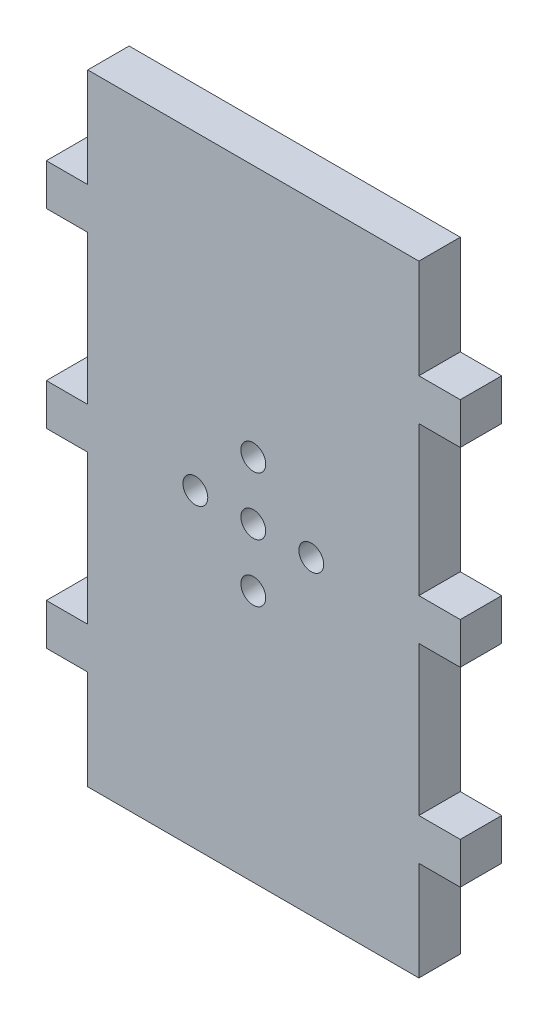
ISO-10303-21;
HEADER;
FILE_DESCRIPTION(('STEP AP214'),'2;1');
FILE_NAME('part.step','',(''),(''),'','','');
FILE_SCHEMA(('AUTOMOTIVE_DESIGN { 1 0 10303 214 1 1 1 1 }'));
ENDSEC;
DATA;
#1=APPLICATION_CONTEXT('core data for automotive mechanical design processes');
#2=APPLICATION_PROTOCOL_DEFINITION('international standard','automotive_design',2000,#1);
#3=PRODUCT_CONTEXT('',#1,'mechanical');
#4=PRODUCT('Part','Part','',(#3));
#5=PRODUCT_RELATED_PRODUCT_CATEGORY('part','',(#4));
#6=PRODUCT_DEFINITION_FORMATION('','',#4);
#7=PRODUCT_DEFINITION_CONTEXT('part definition',#1,'design');
#8=PRODUCT_DEFINITION('design','',#6,#7);
#9=PRODUCT_DEFINITION_SHAPE('','',#8);
#10=(LENGTH_UNIT() NAMED_UNIT(*) SI_UNIT(.MILLI.,.METRE.));
#11=(NAMED_UNIT(*) PLANE_ANGLE_UNIT() SI_UNIT($,.RADIAN.));
#12=(NAMED_UNIT(*) SI_UNIT($,.STERADIAN.) SOLID_ANGLE_UNIT());
#13=UNCERTAINTY_MEASURE_WITH_UNIT(LENGTH_MEASURE(1.E-05),#10,'distance_accuracy_value','');
#14=(GEOMETRIC_REPRESENTATION_CONTEXT(3) GLOBAL_UNCERTAINTY_ASSIGNED_CONTEXT((#13)) GLOBAL_UNIT_ASSIGNED_CONTEXT((#10,
#11,#12)) REPRESENTATION_CONTEXT('',''));
#15=CARTESIAN_POINT('',(0.,0.,0.));
#16=DIRECTION('',(0.,0.,1.));
#17=DIRECTION('',(1.,0.,0.));
#18=AXIS2_PLACEMENT_3D('',#15,#16,#17);
#19=CARTESIAN_POINT('',(0.,0.,5.));
#20=DIRECTION('',(0.,0.,-1.));
#21=DIRECTION('',(-1.,0.,0.));
#22=AXIS2_PLACEMENT_3D('',#19,#20,#21);
#23=PLANE('',#22);
#24=DIRECTION('',(-1.,0.,0.));
#25=VECTOR('',#24,1.);
#26=CARTESIAN_POINT('',(0.,9.97034237203474,5.));
#27=LINE('',#26,#25);
#28=CARTESIAN_POINT('',(40.,9.97034237203474,5.));
#29=VERTEX_POINT('',#28);
#30=CARTESIAN_POINT('',(0.,9.97034237203474,5.));
#31=VERTEX_POINT('',#30);
#32=EDGE_CURVE('E313',#29,#31,#27,.T.);
#33=ORIENTED_EDGE('',*,*,#32,.T.);
#34=DIRECTION('',(0.,-1.,0.));
#35=VECTOR('',#34,1.);
#36=CARTESIAN_POINT('',(0.,9.97034237203474,5.));
#37=LINE('',#36,#35);
#38=CARTESIAN_POINT('',(0.,-2.02965762796526,5.));
#39=VERTEX_POINT('',#38);
#40=EDGE_CURVE('E163',#31,#39,#37,.T.);
#41=ORIENTED_EDGE('',*,*,#40,.T.);
#42=DIRECTION('',(-1.,0.,0.));
#43=VECTOR('',#42,1.);
#44=CARTESIAN_POINT('',(0.,-2.02965762796526,5.));
#45=LINE('',#44,#43);
#46=CARTESIAN_POINT('',(-5.00000000000001,-2.02965762796526,5.));
#47=VERTEX_POINT('',#46);
#48=EDGE_CURVE('E387',#39,#47,#45,.T.);
#49=ORIENTED_EDGE('',*,*,#48,.T.);
#50=DIRECTION('',(0.,-1.,0.));
#51=VECTOR('',#50,1.);
#52=CARTESIAN_POINT('',(-5.00000000000001,-2.02965762796526,5.));
#53=LINE('',#52,#51);
#54=CARTESIAN_POINT('',(-5.00000000000001,-7.02965762796526,5.));
#55=VERTEX_POINT('',#54);
#56=EDGE_CURVE('E410',#47,#55,#53,.T.);
#57=ORIENTED_EDGE('',*,*,#56,.T.);
#58=DIRECTION('',(1.,0.,0.));
#59=VECTOR('',#58,1.);
#60=CARTESIAN_POINT('',(-5.00000000000001,-7.02965762796526,5.));
#61=LINE('',#60,#59);
#62=CARTESIAN_POINT('',(0.,-7.02965762796526,5.));
#63=VERTEX_POINT('',#62);
#64=EDGE_CURVE('E402',#55,#63,#61,.T.);
#65=ORIENTED_EDGE('',*,*,#64,.T.);
#66=DIRECTION('',(0.,-1.,0.));
#67=VECTOR('',#66,1.);
#68=CARTESIAN_POINT('',(0.,-7.02965762796526,5.));
#69=LINE('',#68,#67);
#70=CARTESIAN_POINT('',(0.,-25.0296576279653,5.));
#71=VERTEX_POINT('',#70);
#72=EDGE_CURVE('E406',#63,#71,#69,.T.);
#73=ORIENTED_EDGE('',*,*,#72,.T.);
#74=DIRECTION('',(-1.,0.,0.));
#75=VECTOR('',#74,1.);
#76=CARTESIAN_POINT('',(0.,-25.0296576279653,5.));
#77=LINE('',#76,#75);
#78=CARTESIAN_POINT('',(-5.,-25.0296576279653,5.));
#79=VERTEX_POINT('',#78);
#80=EDGE_CURVE('E407',#71,#79,#77,.T.);
#81=ORIENTED_EDGE('',*,*,#80,.T.);
#82=DIRECTION('',(0.,-1.,0.));
#83=VECTOR('',#82,1.);
#84=CARTESIAN_POINT('',(-5.,-25.0296576279653,5.));
#85=LINE('',#84,#83);
#86=CARTESIAN_POINT('',(-5.,-30.0296576279653,5.));
#87=VERTEX_POINT('',#86);
#88=EDGE_CURVE('E414',#79,#87,#85,.T.);
#89=ORIENTED_EDGE('',*,*,#88,.T.);
#90=DIRECTION('',(1.,0.,0.));
#91=VECTOR('',#90,1.);
#92=CARTESIAN_POINT('',(-5.,-30.0296576279653,5.));
#93=LINE('',#92,#91);
#94=CARTESIAN_POINT('',(0.,-30.0296576279653,5.));
#95=VERTEX_POINT('',#94);
#96=EDGE_CURVE('E420',#87,#95,#93,.T.);
#97=ORIENTED_EDGE('',*,*,#96,.T.);
#98=DIRECTION('',(0.,-1.,0.));
#99=VECTOR('',#98,1.);
#100=CARTESIAN_POINT('',(0.,-30.0296576279653,5.));
#101=LINE('',#100,#99);
#102=CARTESIAN_POINT('',(0.,-48.0296576279653,5.));
#103=VERTEX_POINT('',#102);
#104=EDGE_CURVE('E416',#95,#103,#101,.T.);
#105=ORIENTED_EDGE('',*,*,#104,.T.);
#106=DIRECTION('',(-1.,0.,0.));
#107=VECTOR('',#106,1.);
#108=CARTESIAN_POINT('',(-4.99999999999999,-48.0296576279653,5.));
#109=LINE('',#108,#107);
#110=CARTESIAN_POINT('',(-4.99999999999999,-48.0296576279653,5.));
#111=VERTEX_POINT('',#110);
#112=EDGE_CURVE('E423',#103,#111,#109,.T.);
#113=ORIENTED_EDGE('',*,*,#112,.T.);
#114=DIRECTION('',(0.,-1.,0.));
#115=VECTOR('',#114,1.);
#116=CARTESIAN_POINT('',(-4.99999999999999,-53.0296576279653,5.));
#117=LINE('',#116,#115);
#118=CARTESIAN_POINT('',(-4.99999999999999,-53.0296576279653,5.));
#119=VERTEX_POINT('',#118);
#120=EDGE_CURVE('E422',#111,#119,#117,.T.);
#121=ORIENTED_EDGE('',*,*,#120,.T.);
#122=DIRECTION('',(1.,0.,0.));
#123=VECTOR('',#122,1.);
#124=CARTESIAN_POINT('',(0.,-53.0296576279653,5.));
#125=LINE('',#124,#123);
#126=CARTESIAN_POINT('',(0.,-53.0296576279653,5.));
#127=VERTEX_POINT('',#126);
#128=EDGE_CURVE('E421',#119,#127,#125,.T.);
#129=ORIENTED_EDGE('',*,*,#128,.T.);
#130=DIRECTION('',(0.,-1.,0.));
#131=VECTOR('',#130,1.);
#132=CARTESIAN_POINT('',(0.,-53.0296576279653,5.));
#133=LINE('',#132,#131);
#134=CARTESIAN_POINT('',(0.,-65.0296576279652,5.));
#135=VERTEX_POINT('',#134);
#136=EDGE_CURVE('E430',#127,#135,#133,.T.);
#137=ORIENTED_EDGE('',*,*,#136,.T.);
#138=DIRECTION('',(1.,0.,0.));
#139=VECTOR('',#138,1.);
#140=CARTESIAN_POINT('',(0.,-65.0296576279652,5.));
#141=LINE('',#140,#139);
#142=CARTESIAN_POINT('',(40.,-65.0296576279652,5.));
#143=VERTEX_POINT('',#142);
#144=EDGE_CURVE('E429',#135,#143,#141,.T.);
#145=ORIENTED_EDGE('',*,*,#144,.T.);
#146=DIRECTION('',(0.,1.,0.));
#147=VECTOR('',#146,1.);
#148=CARTESIAN_POINT('',(40.,-65.0296576279652,5.));
#149=LINE('',#148,#147);
#150=CARTESIAN_POINT('',(40.,-53.0296576279653,5.));
#151=VERTEX_POINT('',#150);
#152=EDGE_CURVE('E433',#143,#151,#149,.T.);
#153=ORIENTED_EDGE('',*,*,#152,.T.);
#154=DIRECTION('',(1.,0.,0.));
#155=VECTOR('',#154,1.);
#156=CARTESIAN_POINT('',(40.,-53.0296576279653,5.));
#157=LINE('',#156,#155);
#158=CARTESIAN_POINT('',(45.,-53.0296576279653,5.));
#159=VERTEX_POINT('',#158);
#160=EDGE_CURVE('E432',#151,#159,#157,.T.);
#161=ORIENTED_EDGE('',*,*,#160,.T.);
#162=DIRECTION('',(0.,1.,0.));
#163=VECTOR('',#162,1.);
#164=CARTESIAN_POINT('',(45.,-53.0296576279653,5.));
#165=LINE('',#164,#163);
#166=CARTESIAN_POINT('',(45.,-48.0296576279653,5.));
#167=VERTEX_POINT('',#166);
#168=EDGE_CURVE('E431',#159,#167,#165,.T.);
#169=ORIENTED_EDGE('',*,*,#168,.T.);
#170=DIRECTION('',(-1.,0.,0.));
#171=VECTOR('',#170,1.);
#172=CARTESIAN_POINT('',(45.,-48.0296576279653,5.));
#173=LINE('',#172,#171);
#174=CARTESIAN_POINT('',(40.,-48.0296576279653,5.));
#175=VERTEX_POINT('',#174);
#176=EDGE_CURVE('E437',#167,#175,#173,.T.);
#177=ORIENTED_EDGE('',*,*,#176,.T.);
#178=DIRECTION('',(0.,1.,0.));
#179=VECTOR('',#178,1.);
#180=CARTESIAN_POINT('',(40.,-30.0296576279653,5.));
#181=LINE('',#180,#179);
#182=CARTESIAN_POINT('',(40.,-30.0296576279653,5.));
#183=VERTEX_POINT('',#182);
#184=EDGE_CURVE('E440',#175,#183,#181,.T.);
#185=ORIENTED_EDGE('',*,*,#184,.T.);
#186=DIRECTION('',(1.,0.,0.));
#187=VECTOR('',#186,1.);
#188=CARTESIAN_POINT('',(45.,-30.0296576279653,5.));
#189=LINE('',#188,#187);
#190=CARTESIAN_POINT('',(45.,-30.0296576279653,5.));
#191=VERTEX_POINT('',#190);
#192=EDGE_CURVE('E443',#183,#191,#189,.T.);
#193=ORIENTED_EDGE('',*,*,#192,.T.);
#194=DIRECTION('',(0.,1.,0.));
#195=VECTOR('',#194,1.);
#196=CARTESIAN_POINT('',(45.,-25.0296576279653,5.));
#197=LINE('',#196,#195);
#198=CARTESIAN_POINT('',(45.,-25.0296576279653,5.));
#199=VERTEX_POINT('',#198);
#200=EDGE_CURVE('E441',#191,#199,#197,.T.);
#201=ORIENTED_EDGE('',*,*,#200,.T.);
#202=DIRECTION('',(-1.,0.,0.));
#203=VECTOR('',#202,1.);
#204=CARTESIAN_POINT('',(40.,-25.0296576279653,5.));
#205=LINE('',#204,#203);
#206=CARTESIAN_POINT('',(40.,-25.0296576279653,5.));
#207=VERTEX_POINT('',#206);
#208=EDGE_CURVE('E442',#199,#207,#205,.T.);
#209=ORIENTED_EDGE('',*,*,#208,.T.);
#210=DIRECTION('',(0.,1.,0.));
#211=VECTOR('',#210,1.);
#212=CARTESIAN_POINT('',(40.,-7.02965762796526,5.));
#213=LINE('',#212,#211);
#214=CARTESIAN_POINT('',(40.,-7.02965762796526,5.));
#215=VERTEX_POINT('',#214);
#216=EDGE_CURVE('E450',#207,#215,#213,.T.);
#217=ORIENTED_EDGE('',*,*,#216,.T.);
#218=DIRECTION('',(1.,0.,0.));
#219=VECTOR('',#218,1.);
#220=CARTESIAN_POINT('',(45.,-7.02965762796526,5.));
#221=LINE('',#220,#219);
#222=CARTESIAN_POINT('',(45.,-7.02965762796526,5.));
#223=VERTEX_POINT('',#222);
#224=EDGE_CURVE('E238',#215,#223,#221,.T.);
#225=ORIENTED_EDGE('',*,*,#224,.T.);
#226=DIRECTION('',(0.,1.,0.));
#227=VECTOR('',#226,1.);
#228=CARTESIAN_POINT('',(45.,-2.02965762796526,5.));
#229=LINE('',#228,#227);
#230=CARTESIAN_POINT('',(45.,-2.02965762796526,5.));
#231=VERTEX_POINT('',#230);
#232=EDGE_CURVE('E233',#223,#231,#229,.T.);
#233=ORIENTED_EDGE('',*,*,#232,.T.);
#234=DIRECTION('',(-1.,0.,0.));
#235=VECTOR('',#234,1.);
#236=CARTESIAN_POINT('',(40.,-2.02965762796526,5.));
#237=LINE('',#236,#235);
#238=CARTESIAN_POINT('',(40.,-2.02965762796526,5.));
#239=VERTEX_POINT('',#238);
#240=EDGE_CURVE('E239',#231,#239,#237,.T.);
#241=ORIENTED_EDGE('',*,*,#240,.T.);
#242=DIRECTION('',(0.,1.,0.));
#243=VECTOR('',#242,1.);
#244=CARTESIAN_POINT('',(40.,9.97034237203474,5.));
#245=LINE('',#244,#243);
#246=EDGE_CURVE('E59',#239,#29,#245,.T.);
#247=ORIENTED_EDGE('',*,*,#246,.T.);
#248=EDGE_LOOP('',(#33,#41,#49,#57,#65,#73,#81,#89,#97,#105,#113,#121,#129,#137,#145,#153,#161,
#169,#177,#185,#193,#201,#209,#217,#225,#233,#241,#247));
#249=FACE_BOUND('',#248,.T.);
#250=CARTESIAN_POINT('',(20.,-27.5299999979653,5.));
#251=DIRECTION('',(0.,0.,1.));
#252=DIRECTION('',(1.,0.,0.));
#253=AXIS2_PLACEMENT_3D('',#250,#251,#252);
#254=CIRCLE('',#253,1.5);
#255=CARTESIAN_POINT('',(21.5,-27.5299999979653,5.));
#256=VERTEX_POINT('',#255);
#257=EDGE_CURVE('E265',#256,#256,#254,.T.);
#258=ORIENTED_EDGE('',*,*,#257,.F.);
#259=EDGE_LOOP('',(#258));
#260=FACE_BOUND('',#259,.T.);
#261=CARTESIAN_POINT('',(27.,-27.5299999979653,5.));
#262=DIRECTION('',(0.,0.,1.));
#263=DIRECTION('',(1.,0.,0.));
#264=AXIS2_PLACEMENT_3D('',#261,#262,#263);
#265=CIRCLE('',#264,1.5);
#266=CARTESIAN_POINT('',(28.5,-27.5299999979653,5.));
#267=VERTEX_POINT('',#266);
#268=EDGE_CURVE('E523',#267,#267,#265,.T.);
#269=ORIENTED_EDGE('',*,*,#268,.F.);
#270=EDGE_LOOP('',(#269));
#271=FACE_BOUND('',#270,.T.);
#272=CARTESIAN_POINT('',(20.,-20.5299999979653,5.));
#273=DIRECTION('',(0.,0.,1.));
#274=DIRECTION('',(1.,0.,0.));
#275=AXIS2_PLACEMENT_3D('',#272,#273,#274);
#276=CIRCLE('',#275,1.5);
#277=CARTESIAN_POINT('',(21.5,-20.5299999979653,5.));
#278=VERTEX_POINT('',#277);
#279=EDGE_CURVE('E511',#278,#278,#276,.T.);
#280=ORIENTED_EDGE('',*,*,#279,.F.);
#281=EDGE_LOOP('',(#280));
#282=FACE_BOUND('',#281,.T.);
#283=CARTESIAN_POINT('',(13.,-27.5299999979653,5.));
#284=DIRECTION('',(0.,0.,1.));
#285=DIRECTION('',(1.,0.,0.));
#286=AXIS2_PLACEMENT_3D('',#283,#284,#285);
#287=CIRCLE('',#286,1.5);
#288=CARTESIAN_POINT('',(14.5,-27.5299999979653,5.));
#289=VERTEX_POINT('',#288);
#290=EDGE_CURVE('E506',#289,#289,#287,.T.);
#291=ORIENTED_EDGE('',*,*,#290,.F.);
#292=EDGE_LOOP('',(#291));
#293=FACE_BOUND('',#292,.T.);
#294=CARTESIAN_POINT('',(20.,-34.5299999979653,5.));
#295=DIRECTION('',(0.,0.,1.));
#296=DIRECTION('',(1.,0.,0.));
#297=AXIS2_PLACEMENT_3D('',#294,#295,#296);
#298=CIRCLE('',#297,1.5);
#299=CARTESIAN_POINT('',(21.5,-34.5299999979653,5.));
#300=VERTEX_POINT('',#299);
#301=EDGE_CURVE('E499',#300,#300,#298,.T.);
#302=ORIENTED_EDGE('',*,*,#301,.F.);
#303=EDGE_LOOP('',(#302));
#304=FACE_BOUND('',#303,.T.);
#305=ADVANCED_FACE('F41',(#249,#260,#271,#282,#293,#304),#23,.F.);
#306=CARTESIAN_POINT('',(0.,0.,0.));
#307=DIRECTION('',(0.,0.,-1.));
#308=DIRECTION('',(-1.,0.,0.));
#309=AXIS2_PLACEMENT_3D('',#306,#307,#308);
#310=PLANE('',#309);
#311=CARTESIAN_POINT('',(13.,-27.5299999979653,0.));
#312=DIRECTION('',(0.,0.,1.));
#313=DIRECTION('',(1.,0.,0.));
#314=AXIS2_PLACEMENT_3D('',#311,#312,#313);
#315=CIRCLE('',#314,1.5);
#316=CARTESIAN_POINT('',(14.5,-27.5299999979653,0.));
#317=VERTEX_POINT('',#316);
#318=EDGE_CURVE('E507',#317,#317,#315,.T.);
#319=ORIENTED_EDGE('',*,*,#318,.T.);
#320=EDGE_LOOP('',(#319));
#321=FACE_BOUND('',#320,.T.);
#322=CARTESIAN_POINT('',(27.,-27.5299999979653,0.));
#323=DIRECTION('',(0.,0.,1.));
#324=DIRECTION('',(1.,0.,0.));
#325=AXIS2_PLACEMENT_3D('',#322,#323,#324);
#326=CIRCLE('',#325,1.5);
#327=CARTESIAN_POINT('',(28.5,-27.5299999979653,0.));
#328=VERTEX_POINT('',#327);
#329=EDGE_CURVE('E516',#328,#328,#326,.T.);
#330=ORIENTED_EDGE('',*,*,#329,.T.);
#331=EDGE_LOOP('',(#330));
#332=FACE_BOUND('',#331,.T.);
#333=DIRECTION('',(-1.,0.,0.));
#334=VECTOR('',#333,1.);
#335=CARTESIAN_POINT('',(0.,9.97034237203474,0.));
#336=LINE('',#335,#334);
#337=CARTESIAN_POINT('',(40.,9.97034237203474,0.));
#338=VERTEX_POINT('',#337);
#339=CARTESIAN_POINT('',(0.,9.97034237203474,0.));
#340=VERTEX_POINT('',#339);
#341=EDGE_CURVE('E256',#338,#340,#336,.T.);
#342=ORIENTED_EDGE('',*,*,#341,.F.);
#343=DIRECTION('',(0.,1.,0.));
#344=VECTOR('',#343,1.);
#345=CARTESIAN_POINT('',(40.,9.97034237203474,0.));
#346=LINE('',#345,#344);
#347=CARTESIAN_POINT('',(40.,-2.02965762796526,0.));
#348=VERTEX_POINT('',#347);
#349=EDGE_CURVE('E152',#348,#338,#346,.T.);
#350=ORIENTED_EDGE('',*,*,#349,.F.);
#351=DIRECTION('',(-1.,0.,0.));
#352=VECTOR('',#351,1.);
#353=CARTESIAN_POINT('',(40.,-2.02965762796526,0.));
#354=LINE('',#353,#352);
#355=CARTESIAN_POINT('',(45.,-2.02965762796526,0.));
#356=VERTEX_POINT('',#355);
#357=EDGE_CURVE('E150',#356,#348,#354,.T.);
#358=ORIENTED_EDGE('',*,*,#357,.F.);
#359=DIRECTION('',(0.,1.,0.));
#360=VECTOR('',#359,1.);
#361=CARTESIAN_POINT('',(45.,-2.02965762796526,0.));
#362=LINE('',#361,#360);
#363=CARTESIAN_POINT('',(45.,-7.02965762796526,0.));
#364=VERTEX_POINT('',#363);
#365=EDGE_CURVE('E246',#364,#356,#362,.T.);
#366=ORIENTED_EDGE('',*,*,#365,.F.);
#367=DIRECTION('',(1.,0.,0.));
#368=VECTOR('',#367,1.);
#369=CARTESIAN_POINT('',(45.,-7.02965762796526,0.));
#370=LINE('',#369,#368);
#371=CARTESIAN_POINT('',(40.,-7.02965762796526,0.));
#372=VERTEX_POINT('',#371);
#373=EDGE_CURVE('E306',#372,#364,#370,.T.);
#374=ORIENTED_EDGE('',*,*,#373,.F.);
#375=DIRECTION('',(0.,1.,0.));
#376=VECTOR('',#375,1.);
#377=CARTESIAN_POINT('',(40.,-7.02965762796526,0.));
#378=LINE('',#377,#376);
#379=CARTESIAN_POINT('',(40.,-25.0296576279653,0.));
#380=VERTEX_POINT('',#379);
#381=EDGE_CURVE('E308',#380,#372,#378,.T.);
#382=ORIENTED_EDGE('',*,*,#381,.F.);
#383=DIRECTION('',(-1.,0.,0.));
#384=VECTOR('',#383,1.);
#385=CARTESIAN_POINT('',(40.,-25.0296576279653,0.));
#386=LINE('',#385,#384);
#387=CARTESIAN_POINT('',(45.,-25.0296576279653,0.));
#388=VERTEX_POINT('',#387);
#389=EDGE_CURVE('E305',#388,#380,#386,.T.);
#390=ORIENTED_EDGE('',*,*,#389,.F.);
#391=DIRECTION('',(0.,1.,0.));
#392=VECTOR('',#391,1.);
#393=CARTESIAN_POINT('',(45.,-25.0296576279653,0.));
#394=LINE('',#393,#392);
#395=CARTESIAN_POINT('',(45.,-30.0296576279653,0.));
#396=VERTEX_POINT('',#395);
#397=EDGE_CURVE('E302',#396,#388,#394,.T.);
#398=ORIENTED_EDGE('',*,*,#397,.F.);
#399=DIRECTION('',(1.,0.,0.));
#400=VECTOR('',#399,1.);
#401=CARTESIAN_POINT('',(45.,-30.0296576279653,0.));
#402=LINE('',#401,#400);
#403=CARTESIAN_POINT('',(40.,-30.0296576279653,0.));
#404=VERTEX_POINT('',#403);
#405=EDGE_CURVE('E296',#404,#396,#402,.T.);
#406=ORIENTED_EDGE('',*,*,#405,.F.);
#407=DIRECTION('',(0.,1.,0.));
#408=VECTOR('',#407,1.);
#409=CARTESIAN_POINT('',(40.,-30.0296576279653,0.));
#410=LINE('',#409,#408);
#411=CARTESIAN_POINT('',(40.,-48.0296576279653,0.));
#412=VERTEX_POINT('',#411);
#413=EDGE_CURVE('E297',#412,#404,#410,.T.);
#414=ORIENTED_EDGE('',*,*,#413,.F.);
#415=DIRECTION('',(-1.,0.,0.));
#416=VECTOR('',#415,1.);
#417=CARTESIAN_POINT('',(45.,-48.0296576279653,0.));
#418=LINE('',#417,#416);
#419=CARTESIAN_POINT('',(45.,-48.0296576279653,0.));
#420=VERTEX_POINT('',#419);
#421=EDGE_CURVE('E298',#420,#412,#418,.T.);
#422=ORIENTED_EDGE('',*,*,#421,.F.);
#423=DIRECTION('',(0.,1.,0.));
#424=VECTOR('',#423,1.);
#425=CARTESIAN_POINT('',(45.,-53.0296576279653,0.));
#426=LINE('',#425,#424);
#427=CARTESIAN_POINT('',(45.,-53.0296576279653,0.));
#428=VERTEX_POINT('',#427);
#429=EDGE_CURVE('E294',#428,#420,#426,.T.);
#430=ORIENTED_EDGE('',*,*,#429,.F.);
#431=DIRECTION('',(1.,0.,0.));
#432=VECTOR('',#431,1.);
#433=CARTESIAN_POINT('',(40.,-53.0296576279653,0.));
#434=LINE('',#433,#432);
#435=CARTESIAN_POINT('',(40.,-53.0296576279653,0.));
#436=VERTEX_POINT('',#435);
#437=EDGE_CURVE('E295',#436,#428,#434,.T.);
#438=ORIENTED_EDGE('',*,*,#437,.F.);
#439=DIRECTION('',(0.,1.,0.));
#440=VECTOR('',#439,1.);
#441=CARTESIAN_POINT('',(40.,-65.0296576279652,0.));
#442=LINE('',#441,#440);
#443=CARTESIAN_POINT('',(40.,-65.0296576279652,0.));
#444=VERTEX_POINT('',#443);
#445=EDGE_CURVE('E286',#444,#436,#442,.T.);
#446=ORIENTED_EDGE('',*,*,#445,.F.);
#447=DIRECTION('',(1.,0.,0.));
#448=VECTOR('',#447,1.);
#449=CARTESIAN_POINT('',(0.,-65.0296576279652,0.));
#450=LINE('',#449,#448);
#451=CARTESIAN_POINT('',(0.,-65.0296576279652,0.));
#452=VERTEX_POINT('',#451);
#453=EDGE_CURVE('E287',#452,#444,#450,.T.);
#454=ORIENTED_EDGE('',*,*,#453,.F.);
#455=DIRECTION('',(0.,-1.,0.));
#456=VECTOR('',#455,1.);
#457=CARTESIAN_POINT('',(0.,-53.0296576279653,0.));
#458=LINE('',#457,#456);
#459=CARTESIAN_POINT('',(0.,-53.0296576279653,0.));
#460=VERTEX_POINT('',#459);
#461=EDGE_CURVE('E288',#460,#452,#458,.T.);
#462=ORIENTED_EDGE('',*,*,#461,.F.);
#463=DIRECTION('',(1.,0.,0.));
#464=VECTOR('',#463,1.);
#465=CARTESIAN_POINT('',(0.,-53.0296576279653,0.));
#466=LINE('',#465,#464);
#467=CARTESIAN_POINT('',(-4.99999999999999,-53.0296576279653,0.));
#468=VERTEX_POINT('',#467);
#469=EDGE_CURVE('E281',#468,#460,#466,.T.);
#470=ORIENTED_EDGE('',*,*,#469,.F.);
#471=DIRECTION('',(0.,-1.,0.));
#472=VECTOR('',#471,1.);
#473=CARTESIAN_POINT('',(-4.99999999999999,-53.0296576279653,0.));
#474=LINE('',#473,#472);
#475=CARTESIAN_POINT('',(-4.99999999999999,-48.0296576279653,0.));
#476=VERTEX_POINT('',#475);
#477=EDGE_CURVE('E285',#476,#468,#474,.T.);
#478=ORIENTED_EDGE('',*,*,#477,.F.);
#479=DIRECTION('',(-1.,0.,0.));
#480=VECTOR('',#479,1.);
#481=CARTESIAN_POINT('',(-4.99999999999999,-48.0296576279653,0.));
#482=LINE('',#481,#480);
#483=CARTESIAN_POINT('',(0.,-48.0296576279653,0.));
#484=VERTEX_POINT('',#483);
#485=EDGE_CURVE('E279',#484,#476,#482,.T.);
#486=ORIENTED_EDGE('',*,*,#485,.F.);
#487=DIRECTION('',(0.,-1.,0.));
#488=VECTOR('',#487,1.);
#489=CARTESIAN_POINT('',(0.,-30.0296576279653,0.));
#490=LINE('',#489,#488);
#491=CARTESIAN_POINT('',(0.,-30.0296576279653,0.));
#492=VERTEX_POINT('',#491);
#493=EDGE_CURVE('E277',#492,#484,#490,.T.);
#494=ORIENTED_EDGE('',*,*,#493,.F.);
#495=DIRECTION('',(1.,0.,0.));
#496=VECTOR('',#495,1.);
#497=CARTESIAN_POINT('',(-5.,-30.0296576279653,0.));
#498=LINE('',#497,#496);
#499=CARTESIAN_POINT('',(-5.,-30.0296576279653,0.));
#500=VERTEX_POINT('',#499);
#501=EDGE_CURVE('E276',#500,#492,#498,.T.);
#502=ORIENTED_EDGE('',*,*,#501,.F.);
#503=DIRECTION('',(0.,-1.,0.));
#504=VECTOR('',#503,1.);
#505=CARTESIAN_POINT('',(-5.,-25.0296576279653,0.));
#506=LINE('',#505,#504);
#507=CARTESIAN_POINT('',(-5.,-25.0296576279653,0.));
#508=VERTEX_POINT('',#507);
#509=EDGE_CURVE('E272',#508,#500,#506,.T.);
#510=ORIENTED_EDGE('',*,*,#509,.F.);
#511=DIRECTION('',(-1.,0.,0.));
#512=VECTOR('',#511,1.);
#513=CARTESIAN_POINT('',(0.,-25.0296576279653,0.));
#514=LINE('',#513,#512);
#515=CARTESIAN_POINT('',(0.,-25.0296576279653,0.));
#516=VERTEX_POINT('',#515);
#517=EDGE_CURVE('E275',#516,#508,#514,.T.);
#518=ORIENTED_EDGE('',*,*,#517,.F.);
#519=DIRECTION('',(0.,-1.,0.));
#520=VECTOR('',#519,1.);
#521=CARTESIAN_POINT('',(0.,-7.02965762796526,0.));
#522=LINE('',#521,#520);
#523=CARTESIAN_POINT('',(0.,-7.02965762796526,0.));
#524=VERTEX_POINT('',#523);
#525=EDGE_CURVE('E269',#524,#516,#522,.T.);
#526=ORIENTED_EDGE('',*,*,#525,.F.);
#527=DIRECTION('',(1.,0.,0.));
#528=VECTOR('',#527,1.);
#529=CARTESIAN_POINT('',(-5.00000000000001,-7.02965762796526,0.));
#530=LINE('',#529,#528);
#531=CARTESIAN_POINT('',(-5.00000000000001,-7.02965762796526,0.));
#532=VERTEX_POINT('',#531);
#533=EDGE_CURVE('E268',#532,#524,#530,.T.);
#534=ORIENTED_EDGE('',*,*,#533,.F.);
#535=DIRECTION('',(0.,-1.,0.));
#536=VECTOR('',#535,1.);
#537=CARTESIAN_POINT('',(-5.00000000000001,-2.02965762796526,0.));
#538=LINE('',#537,#536);
#539=CARTESIAN_POINT('',(-5.00000000000001,-2.02965762796526,0.));
#540=VERTEX_POINT('',#539);
#541=EDGE_CURVE('E266',#540,#532,#538,.T.);
#542=ORIENTED_EDGE('',*,*,#541,.F.);
#543=DIRECTION('',(-1.,0.,0.));
#544=VECTOR('',#543,1.);
#545=CARTESIAN_POINT('',(0.,-2.02965762796526,0.));
#546=LINE('',#545,#544);
#547=CARTESIAN_POINT('',(0.,-2.02965762796526,0.));
#548=VERTEX_POINT('',#547);
#549=EDGE_CURVE('E264',#548,#540,#546,.T.);
#550=ORIENTED_EDGE('',*,*,#549,.F.);
#551=DIRECTION('',(0.,-1.,0.));
#552=VECTOR('',#551,1.);
#553=CARTESIAN_POINT('',(0.,9.97034237203474,0.));
#554=LINE('',#553,#552);
#555=EDGE_CURVE('E263',#340,#548,#554,.T.);
#556=ORIENTED_EDGE('',*,*,#555,.F.);
#557=EDGE_LOOP('',(#342,#350,#358,#366,#374,#382,#390,#398,#406,#414,#422,#430,#438,#446,#454,
#462,#470,#478,#486,#494,#502,#510,#518,#526,#534,#542,#550,#556));
#558=FACE_BOUND('',#557,.T.);
#559=CARTESIAN_POINT('',(20.,-27.5299999979653,0.));
#560=DIRECTION('',(0.,0.,1.));
#561=DIRECTION('',(1.,0.,0.));
#562=AXIS2_PLACEMENT_3D('',#559,#560,#561);
#563=CIRCLE('',#562,1.5);
#564=CARTESIAN_POINT('',(21.5,-27.5299999979653,0.));
#565=VERTEX_POINT('',#564);
#566=EDGE_CURVE('E525',#565,#565,#563,.T.);
#567=ORIENTED_EDGE('',*,*,#566,.T.);
#568=EDGE_LOOP('',(#567));
#569=FACE_BOUND('',#568,.T.);
#570=CARTESIAN_POINT('',(20.,-20.5299999979653,0.));
#571=DIRECTION('',(0.,0.,1.));
#572=DIRECTION('',(1.,0.,0.));
#573=AXIS2_PLACEMENT_3D('',#570,#571,#572);
#574=CIRCLE('',#573,1.5);
#575=CARTESIAN_POINT('',(21.5,-20.5299999979653,0.));
#576=VERTEX_POINT('',#575);
#577=EDGE_CURVE('E514',#576,#576,#574,.T.);
#578=ORIENTED_EDGE('',*,*,#577,.T.);
#579=EDGE_LOOP('',(#578));
#580=FACE_BOUND('',#579,.T.);
#581=CARTESIAN_POINT('',(20.,-34.5299999979653,0.));
#582=DIRECTION('',(0.,0.,1.));
#583=DIRECTION('',(1.,0.,0.));
#584=AXIS2_PLACEMENT_3D('',#581,#582,#583);
#585=CIRCLE('',#584,1.5);
#586=CARTESIAN_POINT('',(21.5,-34.5299999979653,0.));
#587=VERTEX_POINT('',#586);
#588=EDGE_CURVE('E502',#587,#587,#585,.T.);
#589=ORIENTED_EDGE('',*,*,#588,.T.);
#590=EDGE_LOOP('',(#589));
#591=FACE_BOUND('',#590,.T.);
#592=ADVANCED_FACE('F392',(#321,#332,#558,#569,#580,#591),#310,.T.);
#593=CARTESIAN_POINT('',(0.,9.97034237203474,5.));
#594=DIRECTION('',(0.,-1.,0.));
#595=DIRECTION('',(1.,0.,0.));
#596=AXIS2_PLACEMENT_3D('',#593,#594,#595);
#597=PLANE('',#596);
#598=ORIENTED_EDGE('',*,*,#341,.T.);
#599=DIRECTION('',(0.,0.,-1.));
#600=VECTOR('',#599,1.);
#601=CARTESIAN_POINT('',(0.,9.97034237203474,5.));
#602=LINE('',#601,#600);
#603=EDGE_CURVE('E11',#31,#340,#602,.T.);
#604=ORIENTED_EDGE('',*,*,#603,.F.);
#605=ORIENTED_EDGE('',*,*,#32,.F.);
#606=DIRECTION('',(0.,0.,-1.));
#607=VECTOR('',#606,1.);
#608=CARTESIAN_POINT('',(40.,9.97034237203474,5.));
#609=LINE('',#608,#607);
#610=EDGE_CURVE('E255',#29,#338,#609,.T.);
#611=ORIENTED_EDGE('',*,*,#610,.T.);
#612=EDGE_LOOP('',(#598,#604,#605,#611));
#613=FACE_BOUND('',#612,.T.);
#614=ADVANCED_FACE('F43',(#613),#597,.F.);
#615=CARTESIAN_POINT('',(0.,9.97034237203474,5.));
#616=DIRECTION('',(1.,0.,0.));
#617=DIRECTION('',(0.,1.,0.));
#618=AXIS2_PLACEMENT_3D('',#615,#616,#617);
#619=PLANE('',#618);
#620=ORIENTED_EDGE('',*,*,#555,.T.);
#621=DIRECTION('',(0.,0.,-1.));
#622=VECTOR('',#621,1.);
#623=CARTESIAN_POINT('',(0.,-2.02965762796526,5.));
#624=LINE('',#623,#622);
#625=EDGE_CURVE('E49',#39,#548,#624,.T.);
#626=ORIENTED_EDGE('',*,*,#625,.F.);
#627=ORIENTED_EDGE('',*,*,#40,.F.);
#628=ORIENTED_EDGE('',*,*,#603,.T.);
#629=EDGE_LOOP('',(#620,#626,#627,#628));
#630=FACE_BOUND('',#629,.T.);
#631=ADVANCED_FACE('F809',(#630),#619,.F.);
#632=CARTESIAN_POINT('',(0.,-2.02965762796526,5.));
#633=DIRECTION('',(0.,-1.,0.));
#634=DIRECTION('',(1.,0.,0.));
#635=AXIS2_PLACEMENT_3D('',#632,#633,#634);
#636=PLANE('',#635);
#637=ORIENTED_EDGE('',*,*,#549,.T.);
#638=DIRECTION('',(0.,0.,-1.));
#639=VECTOR('',#638,1.);
#640=CARTESIAN_POINT('',(-5.00000000000001,-2.02965762796526,5.));
#641=LINE('',#640,#639);
#642=EDGE_CURVE('E376',#47,#540,#641,.T.);
#643=ORIENTED_EDGE('',*,*,#642,.F.);
#644=ORIENTED_EDGE('',*,*,#48,.F.);
#645=ORIENTED_EDGE('',*,*,#625,.T.);
#646=EDGE_LOOP('',(#637,#643,#644,#645));
#647=FACE_BOUND('',#646,.T.);
#648=ADVANCED_FACE('F388',(#647),#636,.F.);
#649=CARTESIAN_POINT('',(-5.00000000000001,-2.02965762796526,5.));
#650=DIRECTION('',(1.,0.,0.));
#651=DIRECTION('',(0.,1.,0.));
#652=AXIS2_PLACEMENT_3D('',#649,#650,#651);
#653=PLANE('',#652);
#654=ORIENTED_EDGE('',*,*,#541,.T.);
#655=DIRECTION('',(0.,0.,-1.));
#656=VECTOR('',#655,1.);
#657=CARTESIAN_POINT('',(-5.00000000000001,-7.02965762796526,5.));
#658=LINE('',#657,#656);
#659=EDGE_CURVE('E379',#55,#532,#658,.T.);
#660=ORIENTED_EDGE('',*,*,#659,.F.);
#661=ORIENTED_EDGE('',*,*,#56,.F.);
#662=ORIENTED_EDGE('',*,*,#642,.T.);
#663=EDGE_LOOP('',(#654,#660,#661,#662));
#664=FACE_BOUND('',#663,.T.);
#665=ADVANCED_FACE('F396',(#664),#653,.F.);
#666=CARTESIAN_POINT('',(-5.00000000000001,-7.02965762796526,5.));
#667=DIRECTION('',(0.,1.,0.));
#668=DIRECTION('',(-1.,0.,0.));
#669=AXIS2_PLACEMENT_3D('',#666,#667,#668);
#670=PLANE('',#669);
#671=ORIENTED_EDGE('',*,*,#533,.T.);
#672=DIRECTION('',(0.,0.,-1.));
#673=VECTOR('',#672,1.);
#674=CARTESIAN_POINT('',(0.,-7.02965762796526,5.));
#675=LINE('',#674,#673);
#676=EDGE_CURVE('E371',#63,#524,#675,.T.);
#677=ORIENTED_EDGE('',*,*,#676,.F.);
#678=ORIENTED_EDGE('',*,*,#64,.F.);
#679=ORIENTED_EDGE('',*,*,#659,.T.);
#680=EDGE_LOOP('',(#671,#677,#678,#679));
#681=FACE_BOUND('',#680,.T.);
#682=ADVANCED_FACE('F405',(#681),#670,.F.);
#683=CARTESIAN_POINT('',(0.,-7.02965762796526,5.));
#684=DIRECTION('',(1.,0.,0.));
#685=DIRECTION('',(0.,1.,0.));
#686=AXIS2_PLACEMENT_3D('',#683,#684,#685);
#687=PLANE('',#686);
#688=ORIENTED_EDGE('',*,*,#525,.T.);
#689=DIRECTION('',(0.,0.,-1.));
#690=VECTOR('',#689,1.);
#691=CARTESIAN_POINT('',(0.,-25.0296576279653,5.));
#692=LINE('',#691,#690);
#693=EDGE_CURVE('E372',#71,#516,#692,.T.);
#694=ORIENTED_EDGE('',*,*,#693,.F.);
#695=ORIENTED_EDGE('',*,*,#72,.F.);
#696=ORIENTED_EDGE('',*,*,#676,.T.);
#697=EDGE_LOOP('',(#688,#694,#695,#696));
#698=FACE_BOUND('',#697,.T.);
#699=ADVANCED_FACE('F774',(#698),#687,.F.);
#700=CARTESIAN_POINT('',(0.,-25.0296576279653,5.));
#701=DIRECTION('',(0.,-1.,0.));
#702=DIRECTION('',(0.,0.,-1.));
#703=AXIS2_PLACEMENT_3D('',#700,#701,#702);
#704=PLANE('',#703);
#705=ORIENTED_EDGE('',*,*,#517,.T.);
#706=DIRECTION('',(0.,0.,-1.));
#707=VECTOR('',#706,1.);
#708=CARTESIAN_POINT('',(-5.,-25.0296576279653,5.));
#709=LINE('',#708,#707);
#710=EDGE_CURVE('E367',#79,#508,#709,.T.);
#711=ORIENTED_EDGE('',*,*,#710,.F.);
#712=ORIENTED_EDGE('',*,*,#80,.F.);
#713=ORIENTED_EDGE('',*,*,#693,.T.);
#714=EDGE_LOOP('',(#705,#711,#712,#713));
#715=FACE_BOUND('',#714,.T.);
#716=ADVANCED_FACE('F764',(#715),#704,.F.);
#717=CARTESIAN_POINT('',(-5.,-25.0296576279653,5.));
#718=DIRECTION('',(1.,0.,0.));
#719=DIRECTION('',(0.,0.,-1.));
#720=AXIS2_PLACEMENT_3D('',#717,#718,#719);
#721=PLANE('',#720);
#722=ORIENTED_EDGE('',*,*,#509,.T.);
#723=DIRECTION('',(0.,0.,-1.));
#724=VECTOR('',#723,1.);
#725=CARTESIAN_POINT('',(-5.,-30.0296576279653,5.));
#726=LINE('',#725,#724);
#727=EDGE_CURVE('E364',#87,#500,#726,.T.);
#728=ORIENTED_EDGE('',*,*,#727,.F.);
#729=ORIENTED_EDGE('',*,*,#88,.F.);
#730=ORIENTED_EDGE('',*,*,#710,.T.);
#731=EDGE_LOOP('',(#722,#728,#729,#730));
#732=FACE_BOUND('',#731,.T.);
#733=ADVANCED_FACE('F754',(#732),#721,.F.);
#734=CARTESIAN_POINT('',(-5.,-30.0296576279653,5.));
#735=DIRECTION('',(0.,1.,0.));
#736=DIRECTION('',(0.,0.,1.));
#737=AXIS2_PLACEMENT_3D('',#734,#735,#736);
#738=PLANE('',#737);
#739=ORIENTED_EDGE('',*,*,#501,.T.);
#740=DIRECTION('',(0.,0.,-1.));
#741=VECTOR('',#740,1.);
#742=CARTESIAN_POINT('',(0.,-30.0296576279653,5.));
#743=LINE('',#742,#741);
#744=EDGE_CURVE('E365',#95,#492,#743,.T.);
#745=ORIENTED_EDGE('',*,*,#744,.F.);
#746=ORIENTED_EDGE('',*,*,#96,.F.);
#747=ORIENTED_EDGE('',*,*,#727,.T.);
#748=EDGE_LOOP('',(#739,#745,#746,#747));
#749=FACE_BOUND('',#748,.T.);
#750=ADVANCED_FACE('F743',(#749),#738,.F.);
#751=CARTESIAN_POINT('',(0.,-30.0296576279653,5.));
#752=DIRECTION('',(1.,0.,0.));
#753=DIRECTION('',(0.,0.,-1.));
#754=AXIS2_PLACEMENT_3D('',#751,#752,#753);
#755=PLANE('',#754);
#756=ORIENTED_EDGE('',*,*,#493,.T.);
#757=DIRECTION('',(0.,0.,-1.));
#758=VECTOR('',#757,1.);
#759=CARTESIAN_POINT('',(0.,-48.0296576279653,5.));
#760=LINE('',#759,#758);
#761=EDGE_CURVE('E357',#103,#484,#760,.T.);
#762=ORIENTED_EDGE('',*,*,#761,.F.);
#763=ORIENTED_EDGE('',*,*,#104,.F.);
#764=ORIENTED_EDGE('',*,*,#744,.T.);
#765=EDGE_LOOP('',(#756,#762,#763,#764));
#766=FACE_BOUND('',#765,.T.);
#767=ADVANCED_FACE('F733',(#766),#755,.F.);
#768=CARTESIAN_POINT('',(-4.99999999999999,-48.0296576279653,5.));
#769=DIRECTION('',(0.,-1.,0.));
#770=DIRECTION('',(0.,0.,-1.));
#771=AXIS2_PLACEMENT_3D('',#768,#769,#770);
#772=PLANE('',#771);
#773=ORIENTED_EDGE('',*,*,#485,.T.);
#774=DIRECTION('',(0.,0.,-1.));
#775=VECTOR('',#774,1.);
#776=CARTESIAN_POINT('',(-4.99999999999999,-48.0296576279653,5.));
#777=LINE('',#776,#775);
#778=EDGE_CURVE('E356',#111,#476,#777,.T.);
#779=ORIENTED_EDGE('',*,*,#778,.F.);
#780=ORIENTED_EDGE('',*,*,#112,.F.);
#781=ORIENTED_EDGE('',*,*,#761,.T.);
#782=EDGE_LOOP('',(#773,#779,#780,#781));
#783=FACE_BOUND('',#782,.T.);
#784=ADVANCED_FACE('F724',(#783),#772,.F.);
#785=CARTESIAN_POINT('',(-4.99999999999999,-53.0296576279653,5.));
#786=DIRECTION('',(1.,0.,0.));
#787=DIRECTION('',(0.,1.,0.));
#788=AXIS2_PLACEMENT_3D('',#785,#786,#787);
#789=PLANE('',#788);
#790=ORIENTED_EDGE('',*,*,#477,.T.);
#791=DIRECTION('',(0.,0.,-1.));
#792=VECTOR('',#791,1.);
#793=CARTESIAN_POINT('',(-4.99999999999999,-53.0296576279653,5.));
#794=LINE('',#793,#792);
#795=EDGE_CURVE('E351',#119,#468,#794,.T.);
#796=ORIENTED_EDGE('',*,*,#795,.F.);
#797=ORIENTED_EDGE('',*,*,#120,.F.);
#798=ORIENTED_EDGE('',*,*,#778,.T.);
#799=EDGE_LOOP('',(#790,#796,#797,#798));
#800=FACE_BOUND('',#799,.T.);
#801=ADVANCED_FACE('F712',(#800),#789,.F.);
#802=CARTESIAN_POINT('',(0.,-53.0296576279653,5.));
#803=DIRECTION('',(0.,1.,0.));
#804=DIRECTION('',(0.,0.,1.));
#805=AXIS2_PLACEMENT_3D('',#802,#803,#804);
#806=PLANE('',#805);
#807=ORIENTED_EDGE('',*,*,#469,.T.);
#808=DIRECTION('',(0.,0.,-1.));
#809=VECTOR('',#808,1.);
#810=CARTESIAN_POINT('',(0.,-53.0296576279653,5.));
#811=LINE('',#810,#809);
#812=EDGE_CURVE('E349',#127,#460,#811,.T.);
#813=ORIENTED_EDGE('',*,*,#812,.F.);
#814=ORIENTED_EDGE('',*,*,#128,.F.);
#815=ORIENTED_EDGE('',*,*,#795,.T.);
#816=EDGE_LOOP('',(#807,#813,#814,#815));
#817=FACE_BOUND('',#816,.T.);
#818=ADVANCED_FACE('F701',(#817),#806,.F.);
#819=CARTESIAN_POINT('',(0.,-53.0296576279653,5.));
#820=DIRECTION('',(1.,0.,0.));
#821=DIRECTION('',(0.,0.,-1.));
#822=AXIS2_PLACEMENT_3D('',#819,#820,#821);
#823=PLANE('',#822);
#824=ORIENTED_EDGE('',*,*,#461,.T.);
#825=DIRECTION('',(0.,0.,-1.));
#826=VECTOR('',#825,1.);
#827=CARTESIAN_POINT('',(0.,-65.0296576279652,5.));
#828=LINE('',#827,#826);
#829=EDGE_CURVE('E347',#135,#452,#828,.T.);
#830=ORIENTED_EDGE('',*,*,#829,.F.);
#831=ORIENTED_EDGE('',*,*,#136,.F.);
#832=ORIENTED_EDGE('',*,*,#812,.T.);
#833=EDGE_LOOP('',(#824,#830,#831,#832));
#834=FACE_BOUND('',#833,.T.);
#835=ADVANCED_FACE('F691',(#834),#823,.F.);
#836=CARTESIAN_POINT('',(0.,-65.0296576279652,5.));
#837=DIRECTION('',(0.,1.,0.));
#838=DIRECTION('',(0.,0.,1.));
#839=AXIS2_PLACEMENT_3D('',#836,#837,#838);
#840=PLANE('',#839);
#841=ORIENTED_EDGE('',*,*,#453,.T.);
#842=DIRECTION('',(0.,0.,-1.));
#843=VECTOR('',#842,1.);
#844=CARTESIAN_POINT('',(40.,-65.0296576279652,5.));
#845=LINE('',#844,#843);
#846=EDGE_CURVE('E345',#143,#444,#845,.T.);
#847=ORIENTED_EDGE('',*,*,#846,.F.);
#848=ORIENTED_EDGE('',*,*,#144,.F.);
#849=ORIENTED_EDGE('',*,*,#829,.T.);
#850=EDGE_LOOP('',(#841,#847,#848,#849));
#851=FACE_BOUND('',#850,.T.);
#852=ADVANCED_FACE('F684',(#851),#840,.F.);
#853=CARTESIAN_POINT('',(40.,-65.0296576279652,5.));
#854=DIRECTION('',(-1.,0.,0.));
#855=DIRECTION('',(0.,-1.,0.));
#856=AXIS2_PLACEMENT_3D('',#853,#854,#855);
#857=PLANE('',#856);
#858=ORIENTED_EDGE('',*,*,#445,.T.);
#859=DIRECTION('',(0.,0.,-1.));
#860=VECTOR('',#859,1.);
#861=CARTESIAN_POINT('',(40.,-53.0296576279653,5.));
#862=LINE('',#861,#860);
#863=EDGE_CURVE('E343',#151,#436,#862,.T.);
#864=ORIENTED_EDGE('',*,*,#863,.F.);
#865=ORIENTED_EDGE('',*,*,#152,.F.);
#866=ORIENTED_EDGE('',*,*,#846,.T.);
#867=EDGE_LOOP('',(#858,#864,#865,#866));
#868=FACE_BOUND('',#867,.T.);
#869=ADVANCED_FACE('F674',(#868),#857,.F.);
#870=CARTESIAN_POINT('',(40.,-53.0296576279653,5.));
#871=DIRECTION('',(0.,1.,0.));
#872=DIRECTION('',(0.,0.,1.));
#873=AXIS2_PLACEMENT_3D('',#870,#871,#872);
#874=PLANE('',#873);
#875=ORIENTED_EDGE('',*,*,#437,.T.);
#876=DIRECTION('',(0.,0.,-1.));
#877=VECTOR('',#876,1.);
#878=CARTESIAN_POINT('',(45.,-53.0296576279653,5.));
#879=LINE('',#878,#877);
#880=EDGE_CURVE('E336',#159,#428,#879,.T.);
#881=ORIENTED_EDGE('',*,*,#880,.F.);
#882=ORIENTED_EDGE('',*,*,#160,.F.);
#883=ORIENTED_EDGE('',*,*,#863,.T.);
#884=EDGE_LOOP('',(#875,#881,#882,#883));
#885=FACE_BOUND('',#884,.T.);
#886=ADVANCED_FACE('F664',(#885),#874,.F.);
#887=CARTESIAN_POINT('',(45.,-53.0296576279653,5.));
#888=DIRECTION('',(-1.,0.,0.));
#889=DIRECTION('',(0.,-1.,0.));
#890=AXIS2_PLACEMENT_3D('',#887,#888,#889);
#891=PLANE('',#890);
#892=ORIENTED_EDGE('',*,*,#429,.T.);
#893=DIRECTION('',(0.,0.,-1.));
#894=VECTOR('',#893,1.);
#895=CARTESIAN_POINT('',(45.,-48.0296576279653,5.));
#896=LINE('',#895,#894);
#897=EDGE_CURVE('E331',#167,#420,#896,.T.);
#898=ORIENTED_EDGE('',*,*,#897,.F.);
#899=ORIENTED_EDGE('',*,*,#168,.F.);
#900=ORIENTED_EDGE('',*,*,#880,.T.);
#901=EDGE_LOOP('',(#892,#898,#899,#900));
#902=FACE_BOUND('',#901,.T.);
#903=ADVANCED_FACE('F653',(#902),#891,.F.);
#904=CARTESIAN_POINT('',(45.,-48.0296576279653,5.));
#905=DIRECTION('',(0.,-1.,0.));
#906=DIRECTION('',(0.,0.,-1.));
#907=AXIS2_PLACEMENT_3D('',#904,#905,#906);
#908=PLANE('',#907);
#909=ORIENTED_EDGE('',*,*,#421,.T.);
#910=DIRECTION('',(0.,0.,-1.));
#911=VECTOR('',#910,1.);
#912=CARTESIAN_POINT('',(40.,-48.0296576279653,5.));
#913=LINE('',#912,#911);
#914=EDGE_CURVE('E334',#175,#412,#913,.T.);
#915=ORIENTED_EDGE('',*,*,#914,.F.);
#916=ORIENTED_EDGE('',*,*,#176,.F.);
#917=ORIENTED_EDGE('',*,*,#897,.T.);
#918=EDGE_LOOP('',(#909,#915,#916,#917));
#919=FACE_BOUND('',#918,.T.);
#920=ADVANCED_FACE('F643',(#919),#908,.F.);
#921=CARTESIAN_POINT('',(40.,-30.0296576279653,5.));
#922=DIRECTION('',(-1.,0.,0.));
#923=DIRECTION('',(0.,-1.,0.));
#924=AXIS2_PLACEMENT_3D('',#921,#922,#923);
#925=PLANE('',#924);
#926=ORIENTED_EDGE('',*,*,#413,.T.);
#927=DIRECTION('',(0.,0.,-1.));
#928=VECTOR('',#927,1.);
#929=CARTESIAN_POINT('',(40.,-30.0296576279653,5.));
#930=LINE('',#929,#928);
#931=EDGE_CURVE('E326',#183,#404,#930,.T.);
#932=ORIENTED_EDGE('',*,*,#931,.F.);
#933=ORIENTED_EDGE('',*,*,#184,.F.);
#934=ORIENTED_EDGE('',*,*,#914,.T.);
#935=EDGE_LOOP('',(#926,#932,#933,#934));
#936=FACE_BOUND('',#935,.T.);
#937=ADVANCED_FACE('F634',(#936),#925,.F.);
#938=CARTESIAN_POINT('',(45.,-30.0296576279653,5.));
#939=DIRECTION('',(0.,1.,0.));
#940=DIRECTION('',(0.,0.,1.));
#941=AXIS2_PLACEMENT_3D('',#938,#939,#940);
#942=PLANE('',#941);
#943=ORIENTED_EDGE('',*,*,#405,.T.);
#944=DIRECTION('',(0.,0.,-1.));
#945=VECTOR('',#944,1.);
#946=CARTESIAN_POINT('',(45.,-30.0296576279653,5.));
#947=LINE('',#946,#945);
#948=EDGE_CURVE('E327',#191,#396,#947,.T.);
#949=ORIENTED_EDGE('',*,*,#948,.F.);
#950=ORIENTED_EDGE('',*,*,#192,.F.);
#951=ORIENTED_EDGE('',*,*,#931,.T.);
#952=EDGE_LOOP('',(#943,#949,#950,#951));
#953=FACE_BOUND('',#952,.T.);
#954=ADVANCED_FACE('F622',(#953),#942,.F.);
#955=CARTESIAN_POINT('',(45.,-25.0296576279653,5.));
#956=DIRECTION('',(-1.,0.,0.));
#957=DIRECTION('',(0.,0.,1.));
#958=AXIS2_PLACEMENT_3D('',#955,#956,#957);
#959=PLANE('',#958);
#960=ORIENTED_EDGE('',*,*,#397,.T.);
#961=DIRECTION('',(0.,0.,-1.));
#962=VECTOR('',#961,1.);
#963=CARTESIAN_POINT('',(45.,-25.0296576279653,5.));
#964=LINE('',#963,#962);
#965=EDGE_CURVE('E322',#199,#388,#964,.T.);
#966=ORIENTED_EDGE('',*,*,#965,.F.);
#967=ORIENTED_EDGE('',*,*,#200,.F.);
#968=ORIENTED_EDGE('',*,*,#948,.T.);
#969=EDGE_LOOP('',(#960,#966,#967,#968));
#970=FACE_BOUND('',#969,.T.);
#971=ADVANCED_FACE('F611',(#970),#959,.F.);
#972=CARTESIAN_POINT('',(40.,-25.0296576279653,5.));
#973=DIRECTION('',(0.,-1.,0.));
#974=DIRECTION('',(0.,0.,-1.));
#975=AXIS2_PLACEMENT_3D('',#972,#973,#974);
#976=PLANE('',#975);
#977=ORIENTED_EDGE('',*,*,#389,.T.);
#978=DIRECTION('',(0.,0.,-1.));
#979=VECTOR('',#978,1.);
#980=CARTESIAN_POINT('',(40.,-25.0296576279653,5.));
#981=LINE('',#980,#979);
#982=EDGE_CURVE('E319',#207,#380,#981,.T.);
#983=ORIENTED_EDGE('',*,*,#982,.F.);
#984=ORIENTED_EDGE('',*,*,#208,.F.);
#985=ORIENTED_EDGE('',*,*,#965,.T.);
#986=EDGE_LOOP('',(#977,#983,#984,#985));
#987=FACE_BOUND('',#986,.T.);
#988=ADVANCED_FACE('F607',(#987),#976,.F.);
#989=CARTESIAN_POINT('',(40.,-7.02965762796526,5.));
#990=DIRECTION('',(-1.,0.,0.));
#991=DIRECTION('',(0.,0.,1.));
#992=AXIS2_PLACEMENT_3D('',#989,#990,#991);
#993=PLANE('',#992);
#994=ORIENTED_EDGE('',*,*,#381,.T.);
#995=DIRECTION('',(0.,0.,-1.));
#996=VECTOR('',#995,1.);
#997=CARTESIAN_POINT('',(40.,-7.02965762796526,5.));
#998=LINE('',#997,#996);
#999=EDGE_CURVE('E320',#215,#372,#998,.T.);
#1000=ORIENTED_EDGE('',*,*,#999,.F.);
#1001=ORIENTED_EDGE('',*,*,#216,.F.);
#1002=ORIENTED_EDGE('',*,*,#982,.T.);
#1003=EDGE_LOOP('',(#994,#1000,#1001,#1002));
#1004=FACE_BOUND('',#1003,.T.);
#1005=ADVANCED_FACE('F453',(#1004),#993,.F.);
#1006=CARTESIAN_POINT('',(45.,-7.02965762796526,5.));
#1007=DIRECTION('',(0.,1.,0.));
#1008=DIRECTION('',(-1.,0.,0.));
#1009=AXIS2_PLACEMENT_3D('',#1006,#1007,#1008);
#1010=PLANE('',#1009);
#1011=ORIENTED_EDGE('',*,*,#373,.T.);
#1012=DIRECTION('',(0.,0.,-1.));
#1013=VECTOR('',#1012,1.);
#1014=CARTESIAN_POINT('',(45.,-7.02965762796526,5.));
#1015=LINE('',#1014,#1013);
#1016=EDGE_CURVE('E249',#223,#364,#1015,.T.);
#1017=ORIENTED_EDGE('',*,*,#1016,.F.);
#1018=ORIENTED_EDGE('',*,*,#224,.F.);
#1019=ORIENTED_EDGE('',*,*,#999,.T.);
#1020=EDGE_LOOP('',(#1011,#1017,#1018,#1019));
#1021=FACE_BOUND('',#1020,.T.);
#1022=ADVANCED_FACE('F460',(#1021),#1010,.F.);
#1023=CARTESIAN_POINT('',(45.,-2.02965762796526,5.));
#1024=DIRECTION('',(-1.,0.,0.));
#1025=DIRECTION('',(0.,0.,1.));
#1026=AXIS2_PLACEMENT_3D('',#1023,#1024,#1025);
#1027=PLANE('',#1026);
#1028=ORIENTED_EDGE('',*,*,#365,.T.);
#1029=DIRECTION('',(0.,0.,-1.));
#1030=VECTOR('',#1029,1.);
#1031=CARTESIAN_POINT('',(45.,-2.02965762796526,5.));
#1032=LINE('',#1031,#1030);
#1033=EDGE_CURVE('E241',#231,#356,#1032,.T.);
#1034=ORIENTED_EDGE('',*,*,#1033,.F.);
#1035=ORIENTED_EDGE('',*,*,#232,.F.);
#1036=ORIENTED_EDGE('',*,*,#1016,.T.);
#1037=EDGE_LOOP('',(#1028,#1034,#1035,#1036));
#1038=FACE_BOUND('',#1037,.T.);
#1039=ADVANCED_FACE('F247',(#1038),#1027,.F.);
#1040=CARTESIAN_POINT('',(40.,-2.02965762796526,5.));
#1041=DIRECTION('',(0.,-1.,0.));
#1042=DIRECTION('',(1.,0.,0.));
#1043=AXIS2_PLACEMENT_3D('',#1040,#1041,#1042);
#1044=PLANE('',#1043);
#1045=ORIENTED_EDGE('',*,*,#357,.T.);
#1046=DIRECTION('',(0.,0.,-1.));
#1047=VECTOR('',#1046,1.);
#1048=CARTESIAN_POINT('',(40.,-2.02965762796526,5.));
#1049=LINE('',#1048,#1047);
#1050=EDGE_CURVE('E248',#239,#348,#1049,.T.);
#1051=ORIENTED_EDGE('',*,*,#1050,.F.);
#1052=ORIENTED_EDGE('',*,*,#240,.F.);
#1053=ORIENTED_EDGE('',*,*,#1033,.T.);
#1054=EDGE_LOOP('',(#1045,#1051,#1052,#1053));
#1055=FACE_BOUND('',#1054,.T.);
#1056=ADVANCED_FACE('F254',(#1055),#1044,.F.);
#1057=CARTESIAN_POINT('',(40.,9.97034237203474,5.));
#1058=DIRECTION('',(-1.,0.,0.));
#1059=DIRECTION('',(0.,0.,1.));
#1060=AXIS2_PLACEMENT_3D('',#1057,#1058,#1059);
#1061=PLANE('',#1060);
#1062=ORIENTED_EDGE('',*,*,#349,.T.);
#1063=ORIENTED_EDGE('',*,*,#610,.F.);
#1064=ORIENTED_EDGE('',*,*,#246,.F.);
#1065=ORIENTED_EDGE('',*,*,#1050,.T.);
#1066=EDGE_LOOP('',(#1062,#1063,#1064,#1065));
#1067=FACE_BOUND('',#1066,.T.);
#1068=ADVANCED_FACE('F462',(#1067),#1061,.F.);
#1069=CARTESIAN_POINT('',(20.,-27.5299999979653,5.));
#1070=DIRECTION('',(0.,0.,-1.));
#1071=DIRECTION('',(-1.,0.,0.));
#1072=AXIS2_PLACEMENT_3D('',#1069,#1070,#1071);
#1073=CYLINDRICAL_SURFACE('',#1072,1.5);
#1074=ORIENTED_EDGE('',*,*,#257,.T.);
#1075=EDGE_LOOP('',(#1074));
#1076=FACE_BOUND('',#1075,.T.);
#1077=ORIENTED_EDGE('',*,*,#566,.F.);
#1078=EDGE_LOOP('',(#1077));
#1079=FACE_BOUND('',#1078,.T.);
#1080=ADVANCED_FACE('F464',(#1076,#1079),#1073,.F.);
#1081=CARTESIAN_POINT('',(27.,-27.5299999979653,5.));
#1082=DIRECTION('',(0.,0.,-1.));
#1083=DIRECTION('',(-1.,0.,0.));
#1084=AXIS2_PLACEMENT_3D('',#1081,#1082,#1083);
#1085=CYLINDRICAL_SURFACE('',#1084,1.5);
#1086=ORIENTED_EDGE('',*,*,#268,.T.);
#1087=EDGE_LOOP('',(#1086));
#1088=FACE_BOUND('',#1087,.T.);
#1089=ORIENTED_EDGE('',*,*,#329,.F.);
#1090=EDGE_LOOP('',(#1089));
#1091=FACE_BOUND('',#1090,.T.);
#1092=ADVANCED_FACE('F470',(#1088,#1091),#1085,.F.);
#1093=CARTESIAN_POINT('',(20.,-20.5299999979653,5.));
#1094=DIRECTION('',(0.,0.,-1.));
#1095=DIRECTION('',(-1.,0.,0.));
#1096=AXIS2_PLACEMENT_3D('',#1093,#1094,#1095);
#1097=CYLINDRICAL_SURFACE('',#1096,1.5);
#1098=ORIENTED_EDGE('',*,*,#279,.T.);
#1099=EDGE_LOOP('',(#1098));
#1100=FACE_BOUND('',#1099,.T.);
#1101=ORIENTED_EDGE('',*,*,#577,.F.);
#1102=EDGE_LOOP('',(#1101));
#1103=FACE_BOUND('',#1102,.T.);
#1104=ADVANCED_FACE('F481',(#1100,#1103),#1097,.F.);
#1105=CARTESIAN_POINT('',(13.,-27.5299999979653,5.));
#1106=DIRECTION('',(0.,0.,-1.));
#1107=DIRECTION('',(-1.,0.,0.));
#1108=AXIS2_PLACEMENT_3D('',#1105,#1106,#1107);
#1109=CYLINDRICAL_SURFACE('',#1108,1.5);
#1110=ORIENTED_EDGE('',*,*,#290,.T.);
#1111=EDGE_LOOP('',(#1110));
#1112=FACE_BOUND('',#1111,.T.);
#1113=ORIENTED_EDGE('',*,*,#318,.F.);
#1114=EDGE_LOOP('',(#1113));
#1115=FACE_BOUND('',#1114,.T.);
#1116=ADVANCED_FACE('F490',(#1112,#1115),#1109,.F.);
#1117=CARTESIAN_POINT('',(20.,-34.5299999979653,5.));
#1118=DIRECTION('',(0.,0.,-1.));
#1119=DIRECTION('',(-1.,0.,0.));
#1120=AXIS2_PLACEMENT_3D('',#1117,#1118,#1119);
#1121=CYLINDRICAL_SURFACE('',#1120,1.5);
#1122=ORIENTED_EDGE('',*,*,#301,.T.);
#1123=EDGE_LOOP('',(#1122));
#1124=FACE_BOUND('',#1123,.T.);
#1125=ORIENTED_EDGE('',*,*,#588,.F.);
#1126=EDGE_LOOP('',(#1125));
#1127=FACE_BOUND('',#1126,.T.);
#1128=ADVANCED_FACE('F491',(#1124,#1127),#1121,.F.);
#1129=CLOSED_SHELL('',(#305,#592,#614,#631,#648,#665,#682,#699,#716,#733,#750,#767,#784,#801,
#818,#835,#852,#869,#886,#903,#920,#937,#954,#971,#988,#1005,#1022,#1039,#1056,#1068,#1080,
#1092,#1104,#1116,#1128));
#1130=MANIFOLD_SOLID_BREP('B2',#1129);
#1131=ADVANCED_BREP_SHAPE_REPRESENTATION('',(#18,#1130),#14);
#1132=SHAPE_DEFINITION_REPRESENTATION(#9,#1131);
ENDSEC;
END-ISO-10303-21;
